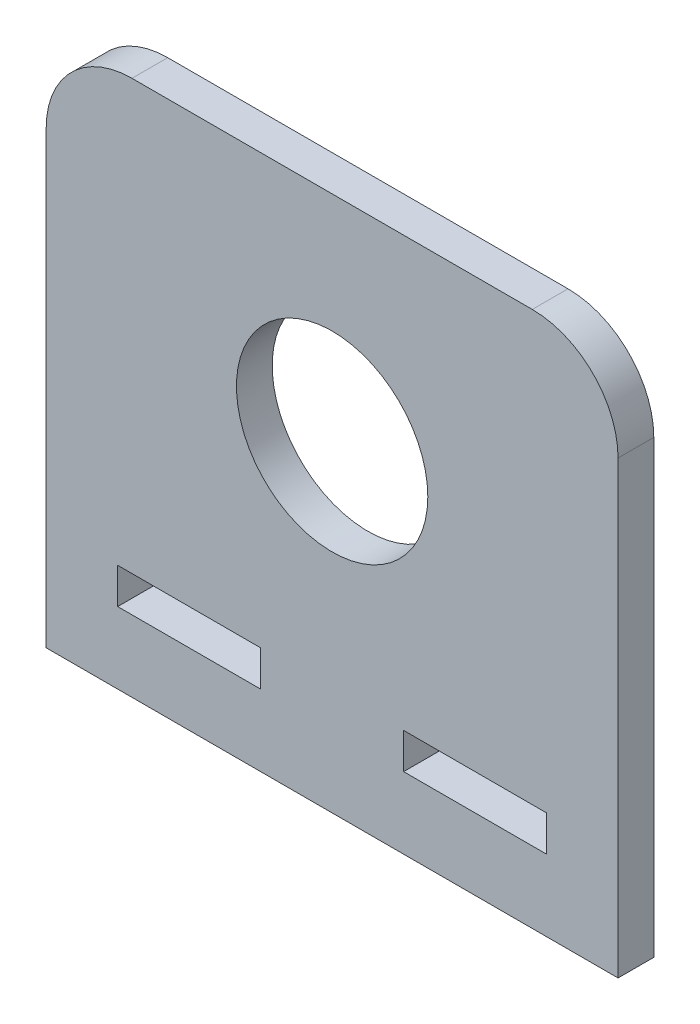
ISO-10303-21;
HEADER;
FILE_DESCRIPTION(('STEP AP214'),'2;1');
FILE_NAME('part.step','',(''),(''),'','','');
FILE_SCHEMA(('AUTOMOTIVE_DESIGN { 1 0 10303 214 1 1 1 1 }'));
ENDSEC;
DATA;
#1=APPLICATION_CONTEXT('core data for automotive mechanical design processes');
#2=APPLICATION_PROTOCOL_DEFINITION('international standard','automotive_design',2000,#1);
#3=PRODUCT_CONTEXT('',#1,'mechanical');
#4=PRODUCT('Part','Part','',(#3));
#5=PRODUCT_RELATED_PRODUCT_CATEGORY('part','',(#4));
#6=PRODUCT_DEFINITION_FORMATION('','',#4);
#7=PRODUCT_DEFINITION_CONTEXT('part definition',#1,'design');
#8=PRODUCT_DEFINITION('design','',#6,#7);
#9=PRODUCT_DEFINITION_SHAPE('','',#8);
#10=(LENGTH_UNIT() NAMED_UNIT(*) SI_UNIT(.MILLI.,.METRE.));
#11=(NAMED_UNIT(*) PLANE_ANGLE_UNIT() SI_UNIT($,.RADIAN.));
#12=(NAMED_UNIT(*) SI_UNIT($,.STERADIAN.) SOLID_ANGLE_UNIT());
#13=UNCERTAINTY_MEASURE_WITH_UNIT(LENGTH_MEASURE(1.E-05),#10,'distance_accuracy_value','');
#14=(GEOMETRIC_REPRESENTATION_CONTEXT(3) GLOBAL_UNCERTAINTY_ASSIGNED_CONTEXT((#13)) GLOBAL_UNIT_ASSIGNED_CONTEXT((#10,
#11,#12)) REPRESENTATION_CONTEXT('',''));
#15=CARTESIAN_POINT('',(0.,0.,0.));
#16=DIRECTION('',(0.,0.,1.));
#17=DIRECTION('',(1.,0.,0.));
#18=AXIS2_PLACEMENT_3D('',#15,#16,#17);
#19=CARTESIAN_POINT('',(43.18,40.005,3.175));
#20=DIRECTION('',(0.,0.,1.));
#21=DIRECTION('',(1.,0.,0.));
#22=AXIS2_PLACEMENT_3D('',#19,#20,#21);
#23=PLANE('',#22);
#24=DIRECTION('',(1.,0.,0.));
#25=VECTOR('',#24,1.);
#26=CARTESIAN_POINT('',(6.35000000000001,6.35,3.175));
#27=LINE('',#26,#25);
#28=CARTESIAN_POINT('',(6.35000000000001,6.35,3.175));
#29=VERTEX_POINT('',#28);
#30=CARTESIAN_POINT('',(19.05,6.35,3.175));
#31=VERTEX_POINT('',#30);
#32=EDGE_CURVE('E178',#29,#31,#27,.T.);
#33=ORIENTED_EDGE('',*,*,#32,.F.);
#34=DIRECTION('',(0.,-1.,0.));
#35=VECTOR('',#34,1.);
#36=CARTESIAN_POINT('',(6.35000000000001,6.35,3.175));
#37=LINE('',#36,#35);
#38=CARTESIAN_POINT('',(6.35000000000001,9.525,3.175));
#39=VERTEX_POINT('',#38);
#40=EDGE_CURVE('E176',#39,#29,#37,.T.);
#41=ORIENTED_EDGE('',*,*,#40,.F.);
#42=DIRECTION('',(-1.,0.,0.));
#43=VECTOR('',#42,1.);
#44=CARTESIAN_POINT('',(6.35000000000001,9.525,3.175));
#45=LINE('',#44,#43);
#46=CARTESIAN_POINT('',(19.05,9.525,3.175));
#47=VERTEX_POINT('',#46);
#48=EDGE_CURVE('E184',#47,#39,#45,.T.);
#49=ORIENTED_EDGE('',*,*,#48,.F.);
#50=DIRECTION('',(0.,1.,0.));
#51=VECTOR('',#50,1.);
#52=CARTESIAN_POINT('',(19.05,6.35,3.175));
#53=LINE('',#52,#51);
#54=EDGE_CURVE('E181',#31,#47,#53,.T.);
#55=ORIENTED_EDGE('',*,*,#54,.F.);
#56=EDGE_LOOP('',(#33,#41,#49,#55));
#57=FACE_BOUND('',#56,.T.);
#58=DIRECTION('',(1.,0.,0.));
#59=VECTOR('',#58,1.);
#60=CARTESIAN_POINT('',(0.,0.,3.175));
#61=LINE('',#60,#59);
#62=CARTESIAN_POINT('',(0.,0.,3.175));
#63=VERTEX_POINT('',#62);
#64=CARTESIAN_POINT('',(50.8,0.,3.175));
#65=VERTEX_POINT('',#64);
#66=EDGE_CURVE('E207',#63,#65,#61,.T.);
#67=ORIENTED_EDGE('',*,*,#66,.T.);
#68=DIRECTION('',(0.,1.,0.));
#69=VECTOR('',#68,1.);
#70=CARTESIAN_POINT('',(50.8,0.,3.175));
#71=LINE('',#70,#69);
#72=CARTESIAN_POINT('',(50.8,40.005,3.175));
#73=VERTEX_POINT('',#72);
#74=EDGE_CURVE('E210',#65,#73,#71,.T.);
#75=ORIENTED_EDGE('',*,*,#74,.T.);
#76=CARTESIAN_POINT('',(43.18,40.005,3.175));
#77=DIRECTION('',(0.,0.,1.));
#78=DIRECTION('',(1.,0.,0.));
#79=AXIS2_PLACEMENT_3D('',#76,#77,#78);
#80=CIRCLE('',#79,7.62);
#81=CARTESIAN_POINT('',(43.18,47.625,3.175));
#82=VERTEX_POINT('',#81);
#83=EDGE_CURVE('E213',#73,#82,#80,.T.);
#84=ORIENTED_EDGE('',*,*,#83,.T.);
#85=DIRECTION('',(-1.,0.,0.));
#86=VECTOR('',#85,1.);
#87=CARTESIAN_POINT('',(43.18,47.625,3.175));
#88=LINE('',#87,#86);
#89=CARTESIAN_POINT('',(7.62,47.625,3.175));
#90=VERTEX_POINT('',#89);
#91=EDGE_CURVE('E215',#82,#90,#88,.T.);
#92=ORIENTED_EDGE('',*,*,#91,.T.);
#93=CARTESIAN_POINT('',(7.62,40.005,3.175));
#94=DIRECTION('',(0.,0.,1.));
#95=DIRECTION('',(1.,0.,0.));
#96=AXIS2_PLACEMENT_3D('',#93,#94,#95);
#97=CIRCLE('',#96,7.62);
#98=CARTESIAN_POINT('',(0.,40.005,3.175));
#99=VERTEX_POINT('',#98);
#100=EDGE_CURVE('E217',#90,#99,#97,.T.);
#101=ORIENTED_EDGE('',*,*,#100,.T.);
#102=DIRECTION('',(0.,-1.,0.));
#103=VECTOR('',#102,1.);
#104=CARTESIAN_POINT('',(0.,40.005,3.175));
#105=LINE('',#104,#103);
#106=EDGE_CURVE('E219',#99,#63,#105,.T.);
#107=ORIENTED_EDGE('',*,*,#106,.T.);
#108=EDGE_LOOP('',(#67,#75,#84,#92,#101,#107));
#109=FACE_BOUND('',#108,.T.);
#110=CARTESIAN_POINT('',(25.4,28.575,3.175));
#111=DIRECTION('',(0.,0.,1.));
#112=DIRECTION('',(1.,0.,0.));
#113=AXIS2_PLACEMENT_3D('',#110,#111,#112);
#114=CIRCLE('',#113,8.5);
#115=CARTESIAN_POINT('',(33.9,28.575,3.175));
#116=VERTEX_POINT('',#115);
#117=EDGE_CURVE('E170',#116,#116,#114,.T.);
#118=ORIENTED_EDGE('',*,*,#117,.F.);
#119=EDGE_LOOP('',(#118));
#120=FACE_BOUND('',#119,.T.);
#121=DIRECTION('',(1.,0.,0.));
#122=VECTOR('',#121,1.);
#123=CARTESIAN_POINT('',(31.75,6.35,3.175));
#124=LINE('',#123,#122);
#125=CARTESIAN_POINT('',(31.75,6.35,3.175));
#126=VERTEX_POINT('',#125);
#127=CARTESIAN_POINT('',(44.45,6.35,3.175));
#128=VERTEX_POINT('',#127);
#129=EDGE_CURVE('E142',#126,#128,#124,.T.);
#130=ORIENTED_EDGE('',*,*,#129,.F.);
#131=DIRECTION('',(0.,-1.,0.));
#132=VECTOR('',#131,1.);
#133=CARTESIAN_POINT('',(31.75,6.35,3.175));
#134=LINE('',#133,#132);
#135=CARTESIAN_POINT('',(31.75,9.525,3.175));
#136=VERTEX_POINT('',#135);
#137=EDGE_CURVE('E134',#136,#126,#134,.T.);
#138=ORIENTED_EDGE('',*,*,#137,.F.);
#139=DIRECTION('',(-1.,0.,0.));
#140=VECTOR('',#139,1.);
#141=CARTESIAN_POINT('',(31.75,9.525,3.175));
#142=LINE('',#141,#140);
#143=CARTESIAN_POINT('',(44.45,9.525,3.175));
#144=VERTEX_POINT('',#143);
#145=EDGE_CURVE('E156',#144,#136,#142,.T.);
#146=ORIENTED_EDGE('',*,*,#145,.F.);
#147=DIRECTION('',(0.,1.,0.));
#148=VECTOR('',#147,1.);
#149=CARTESIAN_POINT('',(44.45,6.35,3.175));
#150=LINE('',#149,#148);
#151=EDGE_CURVE('E154',#128,#144,#150,.T.);
#152=ORIENTED_EDGE('',*,*,#151,.F.);
#153=EDGE_LOOP('',(#130,#138,#146,#152));
#154=FACE_BOUND('',#153,.T.);
#155=ADVANCED_FACE('F33',(#57,#109,#120,#154),#23,.T.);
#156=CARTESIAN_POINT('',(43.18,40.005,0.));
#157=DIRECTION('',(0.,0.,1.));
#158=DIRECTION('',(1.,0.,0.));
#159=AXIS2_PLACEMENT_3D('',#156,#157,#158);
#160=PLANE('',#159);
#161=CARTESIAN_POINT('',(25.4,28.575,0.));
#162=DIRECTION('',(0.,0.,1.));
#163=DIRECTION('',(1.,0.,0.));
#164=AXIS2_PLACEMENT_3D('',#161,#162,#163);
#165=CIRCLE('',#164,8.5);
#166=CARTESIAN_POINT('',(33.9,28.575,0.));
#167=VERTEX_POINT('',#166);
#168=EDGE_CURVE('E150',#167,#167,#165,.T.);
#169=ORIENTED_EDGE('',*,*,#168,.T.);
#170=EDGE_LOOP('',(#169));
#171=FACE_BOUND('',#170,.T.);
#172=DIRECTION('',(0.,-1.,0.));
#173=VECTOR('',#172,1.);
#174=CARTESIAN_POINT('',(6.35000000000001,6.35,0.));
#175=LINE('',#174,#173);
#176=CARTESIAN_POINT('',(6.35000000000001,9.525,0.));
#177=VERTEX_POINT('',#176);
#178=CARTESIAN_POINT('',(6.35000000000001,6.35,0.));
#179=VERTEX_POINT('',#178);
#180=EDGE_CURVE('E173',#177,#179,#175,.T.);
#181=ORIENTED_EDGE('',*,*,#180,.T.);
#182=DIRECTION('',(1.,0.,0.));
#183=VECTOR('',#182,1.);
#184=CARTESIAN_POINT('',(6.35000000000001,6.35,0.));
#185=LINE('',#184,#183);
#186=CARTESIAN_POINT('',(19.05,6.35,0.));
#187=VERTEX_POINT('',#186);
#188=EDGE_CURVE('E189',#179,#187,#185,.T.);
#189=ORIENTED_EDGE('',*,*,#188,.T.);
#190=DIRECTION('',(0.,1.,0.));
#191=VECTOR('',#190,1.);
#192=CARTESIAN_POINT('',(19.05,6.35,0.));
#193=LINE('',#192,#191);
#194=CARTESIAN_POINT('',(19.05,9.525,0.));
#195=VERTEX_POINT('',#194);
#196=EDGE_CURVE('E192',#187,#195,#193,.T.);
#197=ORIENTED_EDGE('',*,*,#196,.T.);
#198=DIRECTION('',(-1.,0.,0.));
#199=VECTOR('',#198,1.);
#200=CARTESIAN_POINT('',(6.35000000000001,9.525,0.));
#201=LINE('',#200,#199);
#202=EDGE_CURVE('E179',#195,#177,#201,.T.);
#203=ORIENTED_EDGE('',*,*,#202,.T.);
#204=EDGE_LOOP('',(#181,#189,#197,#203));
#205=FACE_BOUND('',#204,.T.);
#206=DIRECTION('',(1.,0.,0.));
#207=VECTOR('',#206,1.);
#208=CARTESIAN_POINT('',(0.,0.,0.));
#209=LINE('',#208,#207);
#210=CARTESIAN_POINT('',(0.,0.,0.));
#211=VERTEX_POINT('',#210);
#212=CARTESIAN_POINT('',(50.8,0.,0.));
#213=VERTEX_POINT('',#212);
#214=EDGE_CURVE('E206',#211,#213,#209,.T.);
#215=ORIENTED_EDGE('',*,*,#214,.F.);
#216=DIRECTION('',(0.,-1.,0.));
#217=VECTOR('',#216,1.);
#218=CARTESIAN_POINT('',(0.,40.005,0.));
#219=LINE('',#218,#217);
#220=CARTESIAN_POINT('',(0.,40.005,0.));
#221=VERTEX_POINT('',#220);
#222=EDGE_CURVE('E211',#221,#211,#219,.T.);
#223=ORIENTED_EDGE('',*,*,#222,.F.);
#224=CARTESIAN_POINT('',(7.62,40.005,0.));
#225=DIRECTION('',(0.,0.,1.));
#226=DIRECTION('',(1.,0.,0.));
#227=AXIS2_PLACEMENT_3D('',#224,#225,#226);
#228=CIRCLE('',#227,7.62);
#229=CARTESIAN_POINT('',(7.62,47.625,0.));
#230=VERTEX_POINT('',#229);
#231=EDGE_CURVE('E230',#230,#221,#228,.T.);
#232=ORIENTED_EDGE('',*,*,#231,.F.);
#233=DIRECTION('',(-1.,0.,0.));
#234=VECTOR('',#233,1.);
#235=CARTESIAN_POINT('',(43.18,47.625,0.));
#236=LINE('',#235,#234);
#237=CARTESIAN_POINT('',(43.18,47.625,0.));
#238=VERTEX_POINT('',#237);
#239=EDGE_CURVE('E228',#238,#230,#236,.T.);
#240=ORIENTED_EDGE('',*,*,#239,.F.);
#241=CARTESIAN_POINT('',(43.18,40.005,0.));
#242=DIRECTION('',(0.,0.,1.));
#243=DIRECTION('',(1.,0.,0.));
#244=AXIS2_PLACEMENT_3D('',#241,#242,#243);
#245=CIRCLE('',#244,7.62);
#246=CARTESIAN_POINT('',(50.8,40.005,0.));
#247=VERTEX_POINT('',#246);
#248=EDGE_CURVE('E226',#247,#238,#245,.T.);
#249=ORIENTED_EDGE('',*,*,#248,.F.);
#250=DIRECTION('',(0.,1.,0.));
#251=VECTOR('',#250,1.);
#252=CARTESIAN_POINT('',(50.8,0.,0.));
#253=LINE('',#252,#251);
#254=EDGE_CURVE('E224',#213,#247,#253,.T.);
#255=ORIENTED_EDGE('',*,*,#254,.F.);
#256=EDGE_LOOP('',(#215,#223,#232,#240,#249,#255));
#257=FACE_BOUND('',#256,.T.);
#258=DIRECTION('',(0.,-1.,0.));
#259=VECTOR('',#258,1.);
#260=CARTESIAN_POINT('',(31.75,6.35,0.));
#261=LINE('',#260,#259);
#262=CARTESIAN_POINT('',(31.75,9.525,0.));
#263=VERTEX_POINT('',#262);
#264=CARTESIAN_POINT('',(31.75,6.35,0.));
#265=VERTEX_POINT('',#264);
#266=EDGE_CURVE('E56',#263,#265,#261,.T.);
#267=ORIENTED_EDGE('',*,*,#266,.T.);
#268=DIRECTION('',(1.,0.,0.));
#269=VECTOR('',#268,1.);
#270=CARTESIAN_POINT('',(31.75,6.35,0.));
#271=LINE('',#270,#269);
#272=CARTESIAN_POINT('',(44.45,6.35,0.));
#273=VERTEX_POINT('',#272);
#274=EDGE_CURVE('E149',#265,#273,#271,.T.);
#275=ORIENTED_EDGE('',*,*,#274,.T.);
#276=DIRECTION('',(0.,1.,0.));
#277=VECTOR('',#276,1.);
#278=CARTESIAN_POINT('',(44.45,6.35,0.));
#279=LINE('',#278,#277);
#280=CARTESIAN_POINT('',(44.45,9.525,0.));
#281=VERTEX_POINT('',#280);
#282=EDGE_CURVE('E162',#273,#281,#279,.T.);
#283=ORIENTED_EDGE('',*,*,#282,.T.);
#284=DIRECTION('',(-1.,0.,0.));
#285=VECTOR('',#284,1.);
#286=CARTESIAN_POINT('',(31.75,9.525,0.));
#287=LINE('',#286,#285);
#288=EDGE_CURVE('E143',#281,#263,#287,.T.);
#289=ORIENTED_EDGE('',*,*,#288,.T.);
#290=EDGE_LOOP('',(#267,#275,#283,#289));
#291=FACE_BOUND('',#290,.T.);
#292=ADVANCED_FACE('F254',(#171,#205,#257,#291),#160,.F.);
#293=CARTESIAN_POINT('',(0.,0.,3.175));
#294=DIRECTION('',(0.,1.,0.));
#295=DIRECTION('',(-1.,0.,0.));
#296=AXIS2_PLACEMENT_3D('',#293,#294,#295);
#297=PLANE('',#296);
#298=ORIENTED_EDGE('',*,*,#214,.T.);
#299=DIRECTION('',(0.,0.,-1.));
#300=VECTOR('',#299,1.);
#301=CARTESIAN_POINT('',(50.8,0.,3.175));
#302=LINE('',#301,#300);
#303=EDGE_CURVE('E11',#65,#213,#302,.T.);
#304=ORIENTED_EDGE('',*,*,#303,.F.);
#305=ORIENTED_EDGE('',*,*,#66,.F.);
#306=DIRECTION('',(0.,0.,-1.));
#307=VECTOR('',#306,1.);
#308=CARTESIAN_POINT('',(0.,0.,3.175));
#309=LINE('',#308,#307);
#310=EDGE_CURVE('E221',#63,#211,#309,.T.);
#311=ORIENTED_EDGE('',*,*,#310,.T.);
#312=EDGE_LOOP('',(#298,#304,#305,#311));
#313=FACE_BOUND('',#312,.T.);
#314=ADVANCED_FACE('F35',(#313),#297,.F.);
#315=CARTESIAN_POINT('',(50.8,0.,3.175));
#316=DIRECTION('',(-1.,0.,0.));
#317=DIRECTION('',(0.,-1.,0.));
#318=AXIS2_PLACEMENT_3D('',#315,#316,#317);
#319=PLANE('',#318);
#320=ORIENTED_EDGE('',*,*,#254,.T.);
#321=DIRECTION('',(0.,0.,-1.));
#322=VECTOR('',#321,1.);
#323=CARTESIAN_POINT('',(50.8,40.005,3.175));
#324=LINE('',#323,#322);
#325=EDGE_CURVE('E41',#73,#247,#324,.T.);
#326=ORIENTED_EDGE('',*,*,#325,.F.);
#327=ORIENTED_EDGE('',*,*,#74,.F.);
#328=ORIENTED_EDGE('',*,*,#303,.T.);
#329=EDGE_LOOP('',(#320,#326,#327,#328));
#330=FACE_BOUND('',#329,.T.);
#331=ADVANCED_FACE('F272',(#330),#319,.F.);
#332=CARTESIAN_POINT('',(43.18,40.005,3.175));
#333=DIRECTION('',(0.,0.,-1.));
#334=DIRECTION('',(-1.,0.,0.));
#335=AXIS2_PLACEMENT_3D('',#332,#333,#334);
#336=CYLINDRICAL_SURFACE('',#335,7.62);
#337=ORIENTED_EDGE('',*,*,#248,.T.);
#338=DIRECTION('',(0.,0.,-1.));
#339=VECTOR('',#338,1.);
#340=CARTESIAN_POINT('',(43.18,47.625,3.175));
#341=LINE('',#340,#339);
#342=EDGE_CURVE('E241',#82,#238,#341,.T.);
#343=ORIENTED_EDGE('',*,*,#342,.F.);
#344=ORIENTED_EDGE('',*,*,#83,.F.);
#345=ORIENTED_EDGE('',*,*,#325,.T.);
#346=EDGE_LOOP('',(#337,#343,#344,#345));
#347=FACE_BOUND('',#346,.T.);
#348=ADVANCED_FACE('F248',(#347),#336,.T.);
#349=CARTESIAN_POINT('',(43.18,47.625,3.175));
#350=DIRECTION('',(0.,-1.,0.));
#351=DIRECTION('',(1.,0.,0.));
#352=AXIS2_PLACEMENT_3D('',#349,#350,#351);
#353=PLANE('',#352);
#354=ORIENTED_EDGE('',*,*,#239,.T.);
#355=DIRECTION('',(0.,0.,-1.));
#356=VECTOR('',#355,1.);
#357=CARTESIAN_POINT('',(7.62,47.625,3.175));
#358=LINE('',#357,#356);
#359=EDGE_CURVE('E238',#90,#230,#358,.T.);
#360=ORIENTED_EDGE('',*,*,#359,.F.);
#361=ORIENTED_EDGE('',*,*,#91,.F.);
#362=ORIENTED_EDGE('',*,*,#342,.T.);
#363=EDGE_LOOP('',(#354,#360,#361,#362));
#364=FACE_BOUND('',#363,.T.);
#365=ADVANCED_FACE('F260',(#364),#353,.F.);
#366=CARTESIAN_POINT('',(7.62,40.005,3.175));
#367=DIRECTION('',(0.,0.,-1.));
#368=DIRECTION('',(-1.,0.,0.));
#369=AXIS2_PLACEMENT_3D('',#366,#367,#368);
#370=CYLINDRICAL_SURFACE('',#369,7.62);
#371=ORIENTED_EDGE('',*,*,#231,.T.);
#372=DIRECTION('',(0.,0.,-1.));
#373=VECTOR('',#372,1.);
#374=CARTESIAN_POINT('',(0.,40.005,3.175));
#375=LINE('',#374,#373);
#376=EDGE_CURVE('E235',#99,#221,#375,.T.);
#377=ORIENTED_EDGE('',*,*,#376,.F.);
#378=ORIENTED_EDGE('',*,*,#100,.F.);
#379=ORIENTED_EDGE('',*,*,#359,.T.);
#380=EDGE_LOOP('',(#371,#377,#378,#379));
#381=FACE_BOUND('',#380,.T.);
#382=ADVANCED_FACE('F264',(#381),#370,.T.);
#383=CARTESIAN_POINT('',(0.,40.005,3.175));
#384=DIRECTION('',(1.,0.,0.));
#385=DIRECTION('',(0.,1.,0.));
#386=AXIS2_PLACEMENT_3D('',#383,#384,#385);
#387=PLANE('',#386);
#388=ORIENTED_EDGE('',*,*,#222,.T.);
#389=ORIENTED_EDGE('',*,*,#310,.F.);
#390=ORIENTED_EDGE('',*,*,#106,.F.);
#391=ORIENTED_EDGE('',*,*,#376,.T.);
#392=EDGE_LOOP('',(#388,#389,#390,#391));
#393=FACE_BOUND('',#392,.T.);
#394=ADVANCED_FACE('F275',(#393),#387,.F.);
#395=CARTESIAN_POINT('',(6.35000000000001,6.35,3.175));
#396=DIRECTION('',(1.,0.,0.));
#397=DIRECTION('',(0.,0.,-1.));
#398=AXIS2_PLACEMENT_3D('',#395,#396,#397);
#399=PLANE('',#398);
#400=ORIENTED_EDGE('',*,*,#180,.F.);
#401=DIRECTION('',(0.,0.,-1.));
#402=VECTOR('',#401,1.);
#403=CARTESIAN_POINT('',(6.35000000000001,9.525,3.175));
#404=LINE('',#403,#402);
#405=EDGE_CURVE('E186',#39,#177,#404,.T.);
#406=ORIENTED_EDGE('',*,*,#405,.F.);
#407=ORIENTED_EDGE('',*,*,#40,.T.);
#408=DIRECTION('',(0.,0.,-1.));
#409=VECTOR('',#408,1.);
#410=CARTESIAN_POINT('',(6.35000000000001,6.35,3.175));
#411=LINE('',#410,#409);
#412=EDGE_CURVE('E203',#29,#179,#411,.T.);
#413=ORIENTED_EDGE('',*,*,#412,.T.);
#414=EDGE_LOOP('',(#400,#406,#407,#413));
#415=FACE_BOUND('',#414,.T.);
#416=ADVANCED_FACE('F277',(#415),#399,.T.);
#417=CARTESIAN_POINT('',(6.35000000000001,6.35,3.175));
#418=DIRECTION('',(0.,1.,0.));
#419=DIRECTION('',(0.,0.,1.));
#420=AXIS2_PLACEMENT_3D('',#417,#418,#419);
#421=PLANE('',#420);
#422=ORIENTED_EDGE('',*,*,#188,.F.);
#423=ORIENTED_EDGE('',*,*,#412,.F.);
#424=ORIENTED_EDGE('',*,*,#32,.T.);
#425=DIRECTION('',(0.,0.,-1.));
#426=VECTOR('',#425,1.);
#427=CARTESIAN_POINT('',(19.05,6.35,3.175));
#428=LINE('',#427,#426);
#429=EDGE_CURVE('E201',#31,#187,#428,.T.);
#430=ORIENTED_EDGE('',*,*,#429,.T.);
#431=EDGE_LOOP('',(#422,#423,#424,#430));
#432=FACE_BOUND('',#431,.T.);
#433=ADVANCED_FACE('F283',(#432),#421,.T.);
#434=CARTESIAN_POINT('',(19.05,6.35,3.175));
#435=DIRECTION('',(-1.,0.,0.));
#436=DIRECTION('',(0.,0.,1.));
#437=AXIS2_PLACEMENT_3D('',#434,#435,#436);
#438=PLANE('',#437);
#439=ORIENTED_EDGE('',*,*,#196,.F.);
#440=ORIENTED_EDGE('',*,*,#429,.F.);
#441=ORIENTED_EDGE('',*,*,#54,.T.);
#442=DIRECTION('',(0.,0.,-1.));
#443=VECTOR('',#442,1.);
#444=CARTESIAN_POINT('',(19.05,9.525,3.175));
#445=LINE('',#444,#443);
#446=EDGE_CURVE('E199',#47,#195,#445,.T.);
#447=ORIENTED_EDGE('',*,*,#446,.T.);
#448=EDGE_LOOP('',(#439,#440,#441,#447));
#449=FACE_BOUND('',#448,.T.);
#450=ADVANCED_FACE('F299',(#449),#438,.T.);
#451=CARTESIAN_POINT('',(6.35000000000001,9.525,3.175));
#452=DIRECTION('',(0.,-1.,0.));
#453=DIRECTION('',(0.,0.,-1.));
#454=AXIS2_PLACEMENT_3D('',#451,#452,#453);
#455=PLANE('',#454);
#456=ORIENTED_EDGE('',*,*,#202,.F.);
#457=ORIENTED_EDGE('',*,*,#446,.F.);
#458=ORIENTED_EDGE('',*,*,#48,.T.);
#459=ORIENTED_EDGE('',*,*,#405,.T.);
#460=EDGE_LOOP('',(#456,#457,#458,#459));
#461=FACE_BOUND('',#460,.T.);
#462=ADVANCED_FACE('F303',(#461),#455,.T.);
#463=CARTESIAN_POINT('',(25.4,28.575,3.175));
#464=DIRECTION('',(0.,0.,-1.));
#465=DIRECTION('',(-1.,0.,0.));
#466=AXIS2_PLACEMENT_3D('',#463,#464,#465);
#467=CYLINDRICAL_SURFACE('',#466,8.5);
#468=ORIENTED_EDGE('',*,*,#117,.T.);
#469=EDGE_LOOP('',(#468));
#470=FACE_BOUND('',#469,.T.);
#471=ORIENTED_EDGE('',*,*,#168,.F.);
#472=EDGE_LOOP('',(#471));
#473=FACE_BOUND('',#472,.T.);
#474=ADVANCED_FACE('F307',(#470,#473),#467,.F.);
#475=CARTESIAN_POINT('',(31.75,6.35,3.175));
#476=DIRECTION('',(1.,0.,0.));
#477=DIRECTION('',(0.,0.,-1.));
#478=AXIS2_PLACEMENT_3D('',#475,#476,#477);
#479=PLANE('',#478);
#480=ORIENTED_EDGE('',*,*,#266,.F.);
#481=DIRECTION('',(0.,0.,-1.));
#482=VECTOR('',#481,1.);
#483=CARTESIAN_POINT('',(31.75,9.525,3.175));
#484=LINE('',#483,#482);
#485=EDGE_CURVE('E138',#136,#263,#484,.T.);
#486=ORIENTED_EDGE('',*,*,#485,.F.);
#487=ORIENTED_EDGE('',*,*,#137,.T.);
#488=DIRECTION('',(0.,0.,-1.));
#489=VECTOR('',#488,1.);
#490=CARTESIAN_POINT('',(31.75,6.35,3.175));
#491=LINE('',#490,#489);
#492=EDGE_CURVE('E137',#126,#265,#491,.T.);
#493=ORIENTED_EDGE('',*,*,#492,.T.);
#494=EDGE_LOOP('',(#480,#486,#487,#493));
#495=FACE_BOUND('',#494,.T.);
#496=ADVANCED_FACE('F136',(#495),#479,.T.);
#497=CARTESIAN_POINT('',(31.75,6.35,3.175));
#498=DIRECTION('',(0.,1.,0.));
#499=DIRECTION('',(0.,0.,1.));
#500=AXIS2_PLACEMENT_3D('',#497,#498,#499);
#501=PLANE('',#500);
#502=ORIENTED_EDGE('',*,*,#274,.F.);
#503=ORIENTED_EDGE('',*,*,#492,.F.);
#504=ORIENTED_EDGE('',*,*,#129,.T.);
#505=DIRECTION('',(0.,0.,-1.));
#506=VECTOR('',#505,1.);
#507=CARTESIAN_POINT('',(44.45,6.35,3.175));
#508=LINE('',#507,#506);
#509=EDGE_CURVE('E151',#128,#273,#508,.T.);
#510=ORIENTED_EDGE('',*,*,#509,.T.);
#511=EDGE_LOOP('',(#502,#503,#504,#510));
#512=FACE_BOUND('',#511,.T.);
#513=ADVANCED_FACE('F146',(#512),#501,.T.);
#514=CARTESIAN_POINT('',(44.45,6.35,3.175));
#515=DIRECTION('',(-1.,0.,0.));
#516=DIRECTION('',(0.,0.,1.));
#517=AXIS2_PLACEMENT_3D('',#514,#515,#516);
#518=PLANE('',#517);
#519=ORIENTED_EDGE('',*,*,#282,.F.);
#520=ORIENTED_EDGE('',*,*,#509,.F.);
#521=ORIENTED_EDGE('',*,*,#151,.T.);
#522=DIRECTION('',(0.,0.,-1.));
#523=VECTOR('',#522,1.);
#524=CARTESIAN_POINT('',(44.45,9.525,3.175));
#525=LINE('',#524,#523);
#526=EDGE_CURVE('E48',#144,#281,#525,.T.);
#527=ORIENTED_EDGE('',*,*,#526,.T.);
#528=EDGE_LOOP('',(#519,#520,#521,#527));
#529=FACE_BOUND('',#528,.T.);
#530=ADVANCED_FACE('F316',(#529),#518,.T.);
#531=CARTESIAN_POINT('',(31.75,9.525,3.175));
#532=DIRECTION('',(0.,-1.,0.));
#533=DIRECTION('',(0.,0.,-1.));
#534=AXIS2_PLACEMENT_3D('',#531,#532,#533);
#535=PLANE('',#534);
#536=ORIENTED_EDGE('',*,*,#288,.F.);
#537=ORIENTED_EDGE('',*,*,#526,.F.);
#538=ORIENTED_EDGE('',*,*,#145,.T.);
#539=ORIENTED_EDGE('',*,*,#485,.T.);
#540=EDGE_LOOP('',(#536,#537,#538,#539));
#541=FACE_BOUND('',#540,.T.);
#542=ADVANCED_FACE('F319',(#541),#535,.T.);
#543=CLOSED_SHELL('',(#155,#292,#314,#331,#348,#365,#382,#394,#416,#433,#450,#462,#474,#496,
#513,#530,#542));
#544=MANIFOLD_SOLID_BREP('B2',#543);
#545=ADVANCED_BREP_SHAPE_REPRESENTATION('',(#18,#544),#14);
#546=SHAPE_DEFINITION_REPRESENTATION(#9,#545);
ENDSEC;
END-ISO-10303-21;
